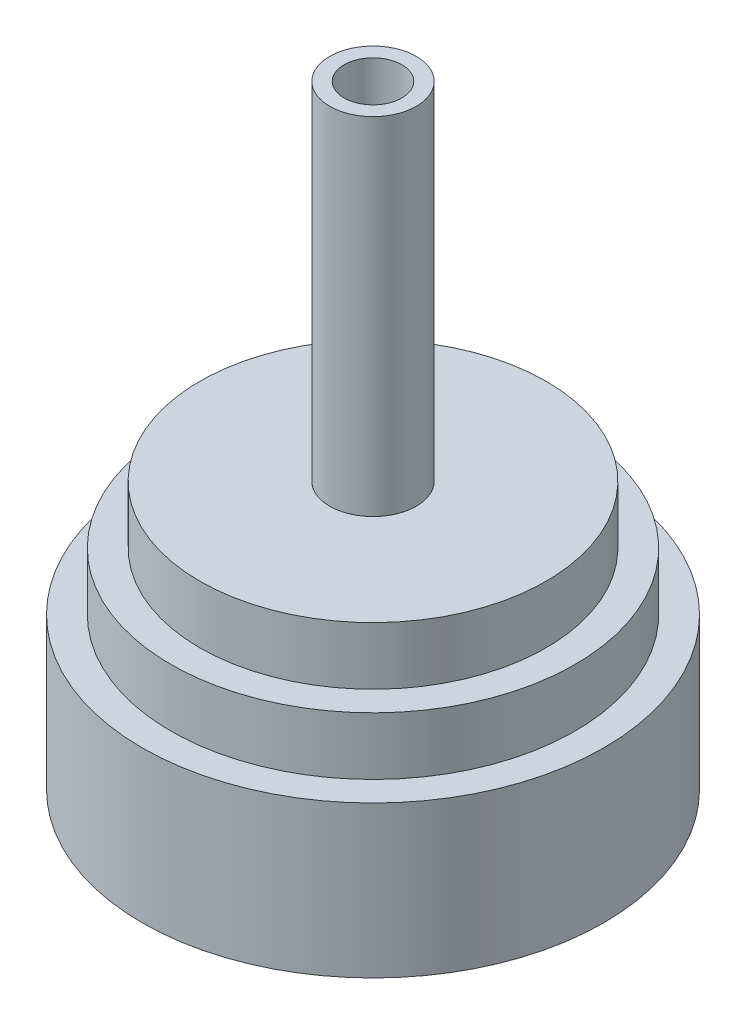
ISO-10303-21;
HEADER;
FILE_DESCRIPTION(('STEP AP214'),'2;1');
FILE_NAME('part.step','',(''),(''),'','','');
FILE_SCHEMA(('AUTOMOTIVE_DESIGN { 1 0 10303 214 1 1 1 1 }'));
ENDSEC;
DATA;
#1=APPLICATION_CONTEXT('core data for automotive mechanical design processes');
#2=APPLICATION_PROTOCOL_DEFINITION('international standard','automotive_design',2000,#1);
#3=PRODUCT_CONTEXT('',#1,'mechanical');
#4=PRODUCT('Part','Part','',(#3));
#5=PRODUCT_RELATED_PRODUCT_CATEGORY('part','',(#4));
#6=PRODUCT_DEFINITION_FORMATION('','',#4);
#7=PRODUCT_DEFINITION_CONTEXT('part definition',#1,'design');
#8=PRODUCT_DEFINITION('design','',#6,#7);
#9=PRODUCT_DEFINITION_SHAPE('','',#8);
#10=(LENGTH_UNIT() NAMED_UNIT(*) SI_UNIT(.MILLI.,.METRE.));
#11=(NAMED_UNIT(*) PLANE_ANGLE_UNIT() SI_UNIT($,.RADIAN.));
#12=(NAMED_UNIT(*) SI_UNIT($,.STERADIAN.) SOLID_ANGLE_UNIT());
#13=UNCERTAINTY_MEASURE_WITH_UNIT(LENGTH_MEASURE(1.E-05),#10,'distance_accuracy_value','');
#14=(GEOMETRIC_REPRESENTATION_CONTEXT(3) GLOBAL_UNCERTAINTY_ASSIGNED_CONTEXT((#13)) GLOBAL_UNIT_ASSIGNED_CONTEXT((#10,
#11,#12)) REPRESENTATION_CONTEXT('',''));
#15=CARTESIAN_POINT('',(0.,0.,0.));
#16=DIRECTION('',(0.,0.,1.));
#17=DIRECTION('',(1.,0.,0.));
#18=AXIS2_PLACEMENT_3D('',#15,#16,#17);
#19=CARTESIAN_POINT('',(0.,0.,0.));
#20=DIRECTION('',(0.,-1.,0.));
#21=DIRECTION('',(0.,0.,-1.));
#22=AXIS2_PLACEMENT_3D('',#19,#20,#21);
#23=CYLINDRICAL_SURFACE('',#22,7.5);
#24=CARTESIAN_POINT('',(0.,-15.,0.));
#25=DIRECTION('',(0.,-1.,0.));
#26=DIRECTION('',(0.,0.,-1.));
#27=AXIS2_PLACEMENT_3D('',#24,#25,#26);
#28=CIRCLE('',#27,7.5);
#29=CARTESIAN_POINT('',(0.,-15.,-7.5));
#30=VERTEX_POINT('',#29);
#31=EDGE_CURVE('E79',#30,#30,#28,.T.);
#32=ORIENTED_EDGE('',*,*,#31,.T.);
#33=EDGE_LOOP('',(#32));
#34=FACE_BOUND('',#33,.T.);
#35=CARTESIAN_POINT('',(0.,0.,0.));
#36=DIRECTION('',(0.,-1.,0.));
#37=DIRECTION('',(0.,0.,-1.));
#38=AXIS2_PLACEMENT_3D('',#35,#36,#37);
#39=CIRCLE('',#38,7.5);
#40=CARTESIAN_POINT('',(0.,0.,-7.5));
#41=VERTEX_POINT('',#40);
#42=EDGE_CURVE('E11',#41,#41,#39,.T.);
#43=ORIENTED_EDGE('',*,*,#42,.F.);
#44=EDGE_LOOP('',(#43));
#45=FACE_BOUND('',#44,.T.);
#46=ADVANCED_FACE('F45',(#34,#45),#23,.F.);
#47=CARTESIAN_POINT('',(0.,0.,-7.5));
#48=DIRECTION('',(0.,1.,0.));
#49=DIRECTION('',(0.,0.,1.));
#50=AXIS2_PLACEMENT_3D('',#47,#48,#49);
#51=PLANE('',#50);
#52=ORIENTED_EDGE('',*,*,#42,.T.);
#53=EDGE_LOOP('',(#52));
#54=FACE_BOUND('',#53,.T.);
#55=CARTESIAN_POINT('',(0.,0.,0.));
#56=DIRECTION('',(0.,-1.,0.));
#57=DIRECTION('',(0.,0.,-1.));
#58=AXIS2_PLACEMENT_3D('',#55,#56,#57);
#59=CIRCLE('',#58,30.);
#60=CARTESIAN_POINT('',(0.,0.,-30.));
#61=VERTEX_POINT('',#60);
#62=EDGE_CURVE('E51',#61,#61,#59,.T.);
#63=ORIENTED_EDGE('',*,*,#62,.F.);
#64=EDGE_LOOP('',(#63));
#65=FACE_BOUND('',#64,.T.);
#66=ADVANCED_FACE('F97',(#54,#65),#51,.T.);
#67=CARTESIAN_POINT('',(0.,0.,0.));
#68=DIRECTION('',(0.,-1.,0.));
#69=DIRECTION('',(0.,0.,-1.));
#70=AXIS2_PLACEMENT_3D('',#67,#68,#69);
#71=CYLINDRICAL_SURFACE('',#70,30.);
#72=ORIENTED_EDGE('',*,*,#62,.T.);
#73=EDGE_LOOP('',(#72));
#74=FACE_BOUND('',#73,.T.);
#75=CARTESIAN_POINT('',(0.,-10.,0.));
#76=DIRECTION('',(0.,-1.,0.));
#77=DIRECTION('',(0.,0.,-1.));
#78=AXIS2_PLACEMENT_3D('',#75,#76,#77);
#79=CIRCLE('',#78,30.);
#80=CARTESIAN_POINT('',(0.,-10.,-30.));
#81=VERTEX_POINT('',#80);
#82=EDGE_CURVE('E55',#81,#81,#79,.T.);
#83=ORIENTED_EDGE('',*,*,#82,.F.);
#84=EDGE_LOOP('',(#83));
#85=FACE_BOUND('',#84,.T.);
#86=ADVANCED_FACE('F101',(#74,#85),#71,.T.);
#87=CARTESIAN_POINT('',(0.,-10.,-30.));
#88=DIRECTION('',(0.,1.,0.));
#89=DIRECTION('',(0.,0.,1.));
#90=AXIS2_PLACEMENT_3D('',#87,#88,#89);
#91=PLANE('',#90);
#92=ORIENTED_EDGE('',*,*,#82,.T.);
#93=EDGE_LOOP('',(#92));
#94=FACE_BOUND('',#93,.T.);
#95=CARTESIAN_POINT('',(0.,-10.,0.));
#96=DIRECTION('',(0.,-1.,0.));
#97=DIRECTION('',(0.,0.,-1.));
#98=AXIS2_PLACEMENT_3D('',#95,#96,#97);
#99=CIRCLE('',#98,35.);
#100=CARTESIAN_POINT('',(0.,-10.,-35.));
#101=VERTEX_POINT('',#100);
#102=EDGE_CURVE('E59',#101,#101,#99,.T.);
#103=ORIENTED_EDGE('',*,*,#102,.F.);
#104=EDGE_LOOP('',(#103));
#105=FACE_BOUND('',#104,.T.);
#106=ADVANCED_FACE('F105',(#94,#105),#91,.T.);
#107=CARTESIAN_POINT('',(0.,0.,0.));
#108=DIRECTION('',(0.,-1.,0.));
#109=DIRECTION('',(0.,0.,-1.));
#110=AXIS2_PLACEMENT_3D('',#107,#108,#109);
#111=CYLINDRICAL_SURFACE('',#110,35.);
#112=ORIENTED_EDGE('',*,*,#102,.T.);
#113=EDGE_LOOP('',(#112));
#114=FACE_BOUND('',#113,.T.);
#115=CARTESIAN_POINT('',(0.,-20.,0.));
#116=DIRECTION('',(0.,-1.,0.));
#117=DIRECTION('',(0.,0.,-1.));
#118=AXIS2_PLACEMENT_3D('',#115,#116,#117);
#119=CIRCLE('',#118,35.);
#120=CARTESIAN_POINT('',(0.,-20.,-35.));
#121=VERTEX_POINT('',#120);
#122=EDGE_CURVE('E64',#121,#121,#119,.T.);
#123=ORIENTED_EDGE('',*,*,#122,.F.);
#124=EDGE_LOOP('',(#123));
#125=FACE_BOUND('',#124,.T.);
#126=ADVANCED_FACE('F111',(#114,#125),#111,.T.);
#127=CARTESIAN_POINT('',(0.,-20.,-35.));
#128=DIRECTION('',(0.,1.,0.));
#129=DIRECTION('',(0.,0.,1.));
#130=AXIS2_PLACEMENT_3D('',#127,#128,#129);
#131=PLANE('',#130);
#132=ORIENTED_EDGE('',*,*,#122,.T.);
#133=EDGE_LOOP('',(#132));
#134=FACE_BOUND('',#133,.T.);
#135=CARTESIAN_POINT('',(0.,-20.,0.));
#136=DIRECTION('',(0.,-1.,0.));
#137=DIRECTION('',(0.,0.,-1.));
#138=AXIS2_PLACEMENT_3D('',#135,#136,#137);
#139=CIRCLE('',#138,40.);
#140=CARTESIAN_POINT('',(0.,-20.,-40.));
#141=VERTEX_POINT('',#140);
#142=EDGE_CURVE('E67',#141,#141,#139,.T.);
#143=ORIENTED_EDGE('',*,*,#142,.F.);
#144=EDGE_LOOP('',(#143));
#145=FACE_BOUND('',#144,.T.);
#146=ADVANCED_FACE('F115',(#134,#145),#131,.T.);
#147=CARTESIAN_POINT('',(0.,0.,0.));
#148=DIRECTION('',(0.,-1.,0.));
#149=DIRECTION('',(0.,0.,-1.));
#150=AXIS2_PLACEMENT_3D('',#147,#148,#149);
#151=CYLINDRICAL_SURFACE('',#150,40.);
#152=ORIENTED_EDGE('',*,*,#142,.T.);
#153=EDGE_LOOP('',(#152));
#154=FACE_BOUND('',#153,.T.);
#155=CARTESIAN_POINT('',(0.,-46.2486935190933,0.));
#156=DIRECTION('',(0.,-1.,0.));
#157=DIRECTION('',(0.,0.,-1.));
#158=AXIS2_PLACEMENT_3D('',#155,#156,#157);
#159=CIRCLE('',#158,40.);
#160=CARTESIAN_POINT('',(0.,-46.2486935190933,-40.));
#161=VERTEX_POINT('',#160);
#162=EDGE_CURVE('E70',#161,#161,#159,.T.);
#163=ORIENTED_EDGE('',*,*,#162,.F.);
#164=EDGE_LOOP('',(#163));
#165=FACE_BOUND('',#164,.T.);
#166=ADVANCED_FACE('F119',(#154,#165),#151,.T.);
#167=CARTESIAN_POINT('',(0.,-40.,0.));
#168=DIRECTION('',(0.,-1.,0.));
#169=DIRECTION('',(0.,0.,-1.));
#170=AXIS2_PLACEMENT_3D('',#167,#168,#169);
#171=CONICAL_SURFACE('',#170,30.,1.01229096615671);
#172=ORIENTED_EDGE('',*,*,#162,.T.);
#173=EDGE_LOOP('',(#172));
#174=FACE_BOUND('',#173,.T.);
#175=CARTESIAN_POINT('',(0.,-40.,0.));
#176=DIRECTION('',(0.,-1.,0.));
#177=DIRECTION('',(0.,0.,-1.));
#178=AXIS2_PLACEMENT_3D('',#175,#176,#177);
#179=CIRCLE('',#178,30.);
#180=CARTESIAN_POINT('',(0.,-40.,-30.));
#181=VERTEX_POINT('',#180);
#182=EDGE_CURVE('E73',#181,#181,#179,.T.);
#183=ORIENTED_EDGE('',*,*,#182,.F.);
#184=EDGE_LOOP('',(#183));
#185=FACE_BOUND('',#184,.T.);
#186=ADVANCED_FACE('F93',(#174,#185),#171,.F.);
#187=CARTESIAN_POINT('',(0.,0.,0.));
#188=DIRECTION('',(0.,-1.,0.));
#189=DIRECTION('',(0.,0.,-1.));
#190=AXIS2_PLACEMENT_3D('',#187,#188,#189);
#191=CYLINDRICAL_SURFACE('',#190,30.);
#192=ORIENTED_EDGE('',*,*,#182,.T.);
#193=EDGE_LOOP('',(#192));
#194=FACE_BOUND('',#193,.T.);
#195=CARTESIAN_POINT('',(0.,-15.,0.));
#196=DIRECTION('',(0.,-1.,0.));
#197=DIRECTION('',(0.,0.,-1.));
#198=AXIS2_PLACEMENT_3D('',#195,#196,#197);
#199=CIRCLE('',#198,30.);
#200=CARTESIAN_POINT('',(0.,-15.,-30.));
#201=VERTEX_POINT('',#200);
#202=EDGE_CURVE('E76',#201,#201,#199,.T.);
#203=ORIENTED_EDGE('',*,*,#202,.F.);
#204=EDGE_LOOP('',(#203));
#205=FACE_BOUND('',#204,.T.);
#206=ADVANCED_FACE('F87',(#194,#205),#191,.F.);
#207=CARTESIAN_POINT('',(0.,-15.,-30.));
#208=DIRECTION('',(0.,-1.,0.));
#209=DIRECTION('',(0.,0.,-1.));
#210=AXIS2_PLACEMENT_3D('',#207,#208,#209);
#211=PLANE('',#210);
#212=ORIENTED_EDGE('',*,*,#202,.T.);
#213=EDGE_LOOP('',(#212));
#214=FACE_BOUND('',#213,.T.);
#215=ORIENTED_EDGE('',*,*,#31,.F.);
#216=EDGE_LOOP('',(#215));
#217=FACE_BOUND('',#216,.T.);
#218=ADVANCED_FACE('F85',(#214,#217),#211,.T.);
#219=CLOSED_SHELL('',(#46,#66,#86,#106,#126,#146,#166,#186,#206,#218));
#220=MANIFOLD_SOLID_BREP('B2',#219);
#221=CARTESIAN_POINT('',(0.,60.,0.));
#222=DIRECTION('',(0.,1.,0.));
#223=DIRECTION('',(0.,0.,1.));
#224=AXIS2_PLACEMENT_3D('',#221,#222,#223);
#225=PLANE('',#224);
#226=CARTESIAN_POINT('',(0.,60.,0.));
#227=DIRECTION('',(0.,1.,0.));
#228=DIRECTION('',(0.,0.,1.));
#229=AXIS2_PLACEMENT_3D('',#226,#227,#228);
#230=CIRCLE('',#229,7.5);
#231=CARTESIAN_POINT('',(0.,60.,7.5));
#232=VERTEX_POINT('',#231);
#233=EDGE_CURVE('E44',#232,#232,#230,.T.);
#234=ORIENTED_EDGE('',*,*,#233,.T.);
#235=EDGE_LOOP('',(#234));
#236=FACE_BOUND('',#235,.T.);
#237=CARTESIAN_POINT('',(0.,60.,0.));
#238=DIRECTION('',(0.,1.,0.));
#239=DIRECTION('',(0.,0.,1.));
#240=AXIS2_PLACEMENT_3D('',#237,#238,#239);
#241=CIRCLE('',#240,5.);
#242=CARTESIAN_POINT('',(0.,60.,5.));
#243=VERTEX_POINT('',#242);
#244=EDGE_CURVE('E208',#243,#243,#241,.T.);
#245=ORIENTED_EDGE('',*,*,#244,.F.);
#246=EDGE_LOOP('',(#245));
#247=FACE_BOUND('',#246,.T.);
#248=ADVANCED_FACE('F197',(#236,#247),#225,.T.);
#249=CARTESIAN_POINT('',(0.,0.,0.));
#250=DIRECTION('',(0.,1.,0.));
#251=DIRECTION('',(0.,0.,1.));
#252=AXIS2_PLACEMENT_3D('',#249,#250,#251);
#253=PLANE('',#252);
#254=CARTESIAN_POINT('',(0.,0.,0.));
#255=DIRECTION('',(0.,1.,0.));
#256=DIRECTION('',(0.,0.,1.));
#257=AXIS2_PLACEMENT_3D('',#254,#255,#256);
#258=CIRCLE('',#257,7.5);
#259=CARTESIAN_POINT('',(0.,0.,7.5));
#260=VERTEX_POINT('',#259);
#261=EDGE_CURVE('E201',#260,#260,#258,.T.);
#262=ORIENTED_EDGE('',*,*,#261,.F.);
#263=EDGE_LOOP('',(#262));
#264=FACE_BOUND('',#263,.T.);
#265=CARTESIAN_POINT('',(0.,0.,0.));
#266=DIRECTION('',(0.,1.,0.));
#267=DIRECTION('',(0.,0.,1.));
#268=AXIS2_PLACEMENT_3D('',#265,#266,#267);
#269=CIRCLE('',#268,5.);
#270=CARTESIAN_POINT('',(0.,0.,5.));
#271=VERTEX_POINT('',#270);
#272=EDGE_CURVE('E210',#271,#271,#269,.T.);
#273=ORIENTED_EDGE('',*,*,#272,.T.);
#274=EDGE_LOOP('',(#273));
#275=FACE_BOUND('',#274,.T.);
#276=ADVANCED_FACE('F220',(#264,#275),#253,.F.);
#277=CARTESIAN_POINT('',(0.,60.,0.));
#278=DIRECTION('',(0.,-1.,0.));
#279=DIRECTION('',(0.,0.,-1.));
#280=AXIS2_PLACEMENT_3D('',#277,#278,#279);
#281=CYLINDRICAL_SURFACE('',#280,7.5);
#282=ORIENTED_EDGE('',*,*,#233,.F.);
#283=EDGE_LOOP('',(#282));
#284=FACE_BOUND('',#283,.T.);
#285=ORIENTED_EDGE('',*,*,#261,.T.);
#286=EDGE_LOOP('',(#285));
#287=FACE_BOUND('',#286,.T.);
#288=ADVANCED_FACE('F199',(#284,#287),#281,.T.);
#289=CARTESIAN_POINT('',(0.,60.,0.));
#290=DIRECTION('',(0.,-1.,0.));
#291=DIRECTION('',(0.,0.,-1.));
#292=AXIS2_PLACEMENT_3D('',#289,#290,#291);
#293=CYLINDRICAL_SURFACE('',#292,5.);
#294=ORIENTED_EDGE('',*,*,#244,.T.);
#295=EDGE_LOOP('',(#294));
#296=FACE_BOUND('',#295,.T.);
#297=ORIENTED_EDGE('',*,*,#272,.F.);
#298=EDGE_LOOP('',(#297));
#299=FACE_BOUND('',#298,.T.);
#300=ADVANCED_FACE('F216',(#296,#299),#293,.F.);
#301=CLOSED_SHELL('',(#248,#276,#288,#300));
#302=MANIFOLD_SOLID_BREP('B6',#301);
#303=ADVANCED_BREP_SHAPE_REPRESENTATION('',(#18,#220,#302),#14);
#304=SHAPE_DEFINITION_REPRESENTATION(#9,#303);
ENDSEC;
END-ISO-10303-21;
